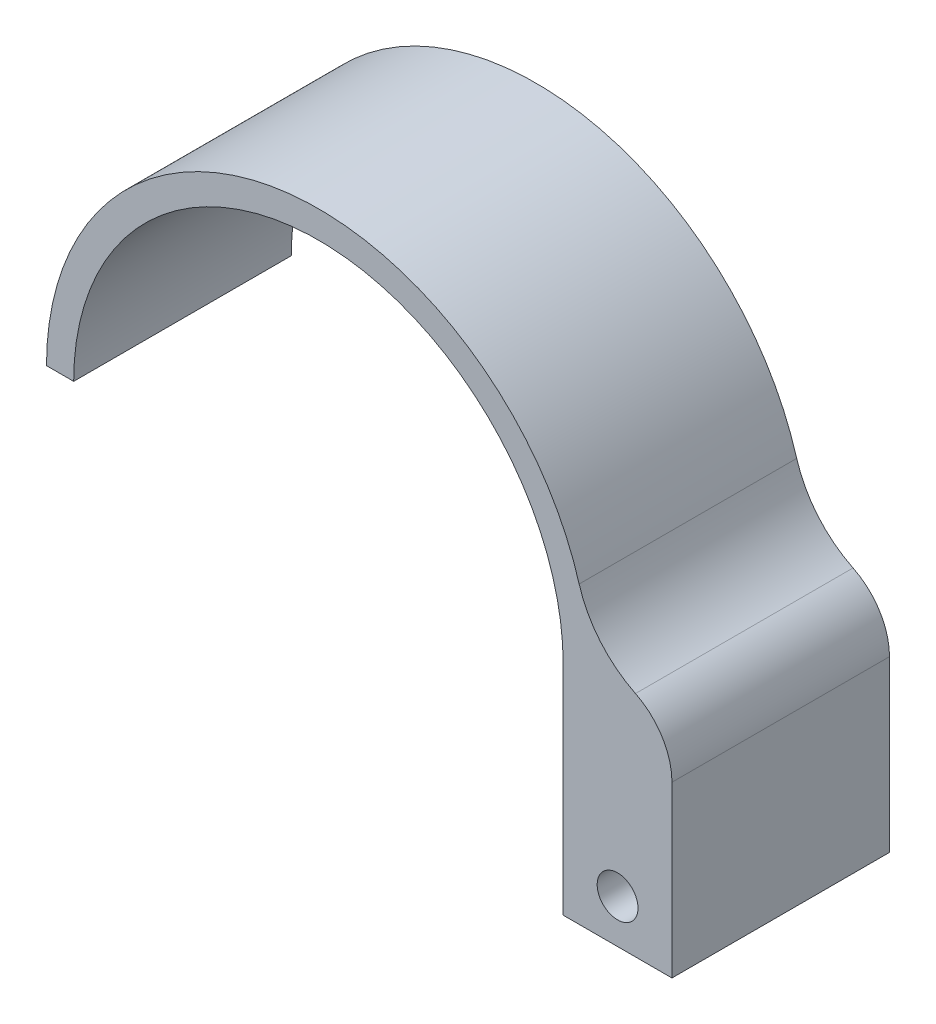
ISO-10303-21;
HEADER;
FILE_DESCRIPTION(('STEP AP214'),'2;1');
FILE_NAME('part.step','',(''),(''),'','','');
FILE_SCHEMA(('AUTOMOTIVE_DESIGN { 1 0 10303 214 1 1 1 1 }'));
ENDSEC;
DATA;
#1=APPLICATION_CONTEXT('core data for automotive mechanical design processes');
#2=APPLICATION_PROTOCOL_DEFINITION('international standard','automotive_design',2000,#1);
#3=PRODUCT_CONTEXT('',#1,'mechanical');
#4=PRODUCT('Part','Part','',(#3));
#5=PRODUCT_RELATED_PRODUCT_CATEGORY('part','',(#4));
#6=PRODUCT_DEFINITION_FORMATION('','',#4);
#7=PRODUCT_DEFINITION_CONTEXT('part definition',#1,'design');
#8=PRODUCT_DEFINITION('design','',#6,#7);
#9=PRODUCT_DEFINITION_SHAPE('','',#8);
#10=(LENGTH_UNIT() NAMED_UNIT(*) SI_UNIT(.MILLI.,.METRE.));
#11=(NAMED_UNIT(*) PLANE_ANGLE_UNIT() SI_UNIT($,.RADIAN.));
#12=(NAMED_UNIT(*) SI_UNIT($,.STERADIAN.) SOLID_ANGLE_UNIT());
#13=UNCERTAINTY_MEASURE_WITH_UNIT(LENGTH_MEASURE(1.E-05),#10,'distance_accuracy_value','');
#14=(GEOMETRIC_REPRESENTATION_CONTEXT(3) GLOBAL_UNCERTAINTY_ASSIGNED_CONTEXT((#13)) GLOBAL_UNIT_ASSIGNED_CONTEXT((#10,
#11,#12)) REPRESENTATION_CONTEXT('',''));
#15=CARTESIAN_POINT('',(0.,0.,0.));
#16=DIRECTION('',(0.,0.,1.));
#17=DIRECTION('',(1.,0.,0.));
#18=AXIS2_PLACEMENT_3D('',#15,#16,#17);
#19=CARTESIAN_POINT('',(0.,-3.80999999999999,9.525));
#20=DIRECTION('',(0.,0.,1.));
#21=DIRECTION('',(1.,0.,0.));
#22=AXIS2_PLACEMENT_3D('',#19,#20,#21);
#23=PLANE('',#22);
#24=CARTESIAN_POINT('',(34.925,-20.32,9.525));
#25=DIRECTION('',(0.,0.,1.));
#26=DIRECTION('',(1.,0.,0.));
#27=AXIS2_PLACEMENT_3D('',#24,#25,#26);
#28=CIRCLE('',#27,2.38125);
#29=CARTESIAN_POINT('',(37.30625,-20.32,9.525));
#30=VERTEX_POINT('',#29);
#31=EDGE_CURVE('E268',#30,#30,#28,.T.);
#32=ORIENTED_EDGE('',*,*,#31,.F.);
#33=EDGE_LOOP('',(#32));
#34=FACE_BOUND('',#33,.T.);
#35=DIRECTION('',(0.,-1.,0.));
#36=VECTOR('',#35,1.);
#37=CARTESIAN_POINT('',(31.3752420857191,-3.80999999999999,9.525));
#38=LINE('',#37,#36);
#39=CARTESIAN_POINT('',(31.3752420857191,-3.80999999999999,9.525));
#40=VERTEX_POINT('',#39);
#41=CARTESIAN_POINT('',(31.3752420857191,-22.86,9.525));
#42=VERTEX_POINT('',#41);
#43=EDGE_CURVE('E145',#40,#42,#38,.T.);
#44=ORIENTED_EDGE('',*,*,#43,.T.);
#45=DIRECTION('',(1.,0.,0.));
#46=VECTOR('',#45,1.);
#47=CARTESIAN_POINT('',(0.,-22.86,9.525));
#48=LINE('',#47,#46);
#49=CARTESIAN_POINT('',(38.4747579142809,-22.86,9.525));
#50=VERTEX_POINT('',#49);
#51=EDGE_CURVE('E129',#42,#50,#48,.T.);
#52=ORIENTED_EDGE('',*,*,#51,.T.);
#53=DIRECTION('',(0.,-1.,0.));
#54=VECTOR('',#53,1.);
#55=CARTESIAN_POINT('',(38.4747579142809,-3.80999999999999,9.525));
#56=LINE('',#55,#54);
#57=CARTESIAN_POINT('',(38.4747579142809,-3.80999999999999,9.525));
#58=VERTEX_POINT('',#57);
#59=EDGE_CURVE('E143',#58,#50,#56,.T.);
#60=ORIENTED_EDGE('',*,*,#59,.F.);
#61=DIRECTION('',(-1.,0.,0.));
#62=VECTOR('',#61,1.);
#63=CARTESIAN_POINT('',(0.,-3.80999999999999,9.525));
#64=LINE('',#63,#62);
#65=EDGE_CURVE('E253',#58,#40,#64,.T.);
#66=ORIENTED_EDGE('',*,*,#65,.T.);
#67=EDGE_LOOP('',(#44,#52,#60,#66));
#68=FACE_BOUND('',#67,.T.);
#69=ADVANCED_FACE('F39',(#34,#68),#23,.T.);
#70=CARTESIAN_POINT('',(0.,-3.80999999999999,15.875));
#71=DIRECTION('',(0.,0.,1.));
#72=DIRECTION('',(1.,0.,0.));
#73=AXIS2_PLACEMENT_3D('',#70,#71,#72);
#74=PLANE('',#73);
#75=CARTESIAN_POINT('',(34.925,-20.32,15.875));
#76=DIRECTION('',(0.,0.,1.));
#77=DIRECTION('',(1.,0.,0.));
#78=AXIS2_PLACEMENT_3D('',#75,#76,#77);
#79=CIRCLE('',#78,2.38125);
#80=CARTESIAN_POINT('',(37.30625,-20.32,15.875));
#81=VERTEX_POINT('',#80);
#82=EDGE_CURVE('E271',#81,#81,#79,.T.);
#83=ORIENTED_EDGE('',*,*,#82,.T.);
#84=EDGE_LOOP('',(#83));
#85=FACE_BOUND('',#84,.T.);
#86=DIRECTION('',(1.,0.,0.));
#87=VECTOR('',#86,1.);
#88=CARTESIAN_POINT('',(0.,-22.86,15.875));
#89=LINE('',#88,#87);
#90=CARTESIAN_POINT('',(31.3752420857191,-22.86,15.875));
#91=VERTEX_POINT('',#90);
#92=CARTESIAN_POINT('',(38.4747579142809,-22.86,15.875));
#93=VERTEX_POINT('',#92);
#94=EDGE_CURVE('E124',#91,#93,#89,.T.);
#95=ORIENTED_EDGE('',*,*,#94,.F.);
#96=DIRECTION('',(0.,-1.,0.));
#97=VECTOR('',#96,1.);
#98=CARTESIAN_POINT('',(31.3752420857191,-3.80999999999999,15.875));
#99=LINE('',#98,#97);
#100=CARTESIAN_POINT('',(31.3752420857191,-3.80999999999999,15.875));
#101=VERTEX_POINT('',#100);
#102=EDGE_CURVE('E137',#101,#91,#99,.T.);
#103=ORIENTED_EDGE('',*,*,#102,.F.);
#104=DIRECTION('',(-1.,0.,0.));
#105=VECTOR('',#104,1.);
#106=CARTESIAN_POINT('',(0.,-3.80999999999999,15.875));
#107=LINE('',#106,#105);
#108=CARTESIAN_POINT('',(38.4747579142809,-3.80999999999999,15.875));
#109=VERTEX_POINT('',#108);
#110=EDGE_CURVE('E141',#109,#101,#107,.T.);
#111=ORIENTED_EDGE('',*,*,#110,.F.);
#112=DIRECTION('',(0.,-1.,0.));
#113=VECTOR('',#112,1.);
#114=CARTESIAN_POINT('',(38.4747579142809,-3.80999999999999,15.875));
#115=LINE('',#114,#113);
#116=EDGE_CURVE('E134',#109,#93,#115,.T.);
#117=ORIENTED_EDGE('',*,*,#116,.T.);
#118=EDGE_LOOP('',(#95,#103,#111,#117));
#119=FACE_BOUND('',#118,.T.);
#120=ADVANCED_FACE('F139',(#85,#119),#74,.F.);
#121=CARTESIAN_POINT('',(0.,-25.4,25.4));
#122=DIRECTION('',(0.,1.,0.));
#123=DIRECTION('',(0.,0.,1.));
#124=AXIS2_PLACEMENT_3D('',#121,#122,#123);
#125=PLANE('',#124);
#126=DIRECTION('',(1.,0.,0.));
#127=VECTOR('',#126,1.);
#128=CARTESIAN_POINT('',(0.,-25.4,0.));
#129=LINE('',#128,#127);
#130=CARTESIAN_POINT('',(28.575,-25.4,0.));
#131=VERTEX_POINT('',#130);
#132=CARTESIAN_POINT('',(41.275,-25.4,0.));
#133=VERTEX_POINT('',#132);
#134=EDGE_CURVE('E173',#131,#133,#129,.T.);
#135=ORIENTED_EDGE('',*,*,#134,.T.);
#136=DIRECTION('',(0.,0.,-1.));
#137=VECTOR('',#136,1.);
#138=CARTESIAN_POINT('',(41.275,-25.4,25.4));
#139=LINE('',#138,#137);
#140=CARTESIAN_POINT('',(41.275,-25.4,25.4));
#141=VERTEX_POINT('',#140);
#142=EDGE_CURVE('E186',#141,#133,#139,.T.);
#143=ORIENTED_EDGE('',*,*,#142,.F.);
#144=DIRECTION('',(1.,0.,0.));
#145=VECTOR('',#144,1.);
#146=CARTESIAN_POINT('',(0.,-25.4,25.4));
#147=LINE('',#146,#145);
#148=CARTESIAN_POINT('',(28.575,-25.4,25.4));
#149=VERTEX_POINT('',#148);
#150=EDGE_CURVE('E158',#149,#141,#147,.T.);
#151=ORIENTED_EDGE('',*,*,#150,.F.);
#152=DIRECTION('',(0.,0.,-1.));
#153=VECTOR('',#152,1.);
#154=CARTESIAN_POINT('',(28.575,-25.4,25.4));
#155=LINE('',#154,#153);
#156=EDGE_CURVE('E189',#149,#131,#155,.T.);
#157=ORIENTED_EDGE('',*,*,#156,.T.);
#158=EDGE_LOOP('',(#135,#143,#151,#157));
#159=FACE_BOUND('',#158,.T.);
#160=CARTESIAN_POINT('',(34.925,-25.4,12.7));
#161=DIRECTION('',(0.,-1.,0.));
#162=DIRECTION('',(0.,0.,-1.));
#163=AXIS2_PLACEMENT_3D('',#160,#161,#162);
#164=CIRCLE('',#163,4.7625);
#165=CARTESIAN_POINT('',(34.925,-25.4,7.9375));
#166=VERTEX_POINT('',#165);
#167=EDGE_CURVE('E251',#166,#166,#164,.T.);
#168=ORIENTED_EDGE('',*,*,#167,.F.);
#169=EDGE_LOOP('',(#168));
#170=FACE_BOUND('',#169,.T.);
#171=ADVANCED_FACE('F245',(#159,#170),#125,.F.);
#172=CARTESIAN_POINT('',(0.,0.,25.4));
#173=DIRECTION('',(0.,0.,-1.));
#174=DIRECTION('',(-1.,0.,0.));
#175=AXIS2_PLACEMENT_3D('',#172,#173,#174);
#176=CYLINDRICAL_SURFACE('',#175,28.575);
#177=CARTESIAN_POINT('',(0.,0.,0.));
#178=DIRECTION('',(0.,0.,1.));
#179=DIRECTION('',(1.,0.,0.));
#180=AXIS2_PLACEMENT_3D('',#177,#178,#179);
#181=CIRCLE('',#180,28.575);
#182=CARTESIAN_POINT('',(28.575,0.,0.));
#183=VERTEX_POINT('',#182);
#184=CARTESIAN_POINT('',(-28.575,0.,0.));
#185=VERTEX_POINT('',#184);
#186=EDGE_CURVE('E168',#183,#185,#181,.T.);
#187=ORIENTED_EDGE('',*,*,#186,.F.);
#188=DIRECTION('',(0.,0.,-1.));
#189=VECTOR('',#188,1.);
#190=CARTESIAN_POINT('',(28.575,0.,25.4));
#191=LINE('',#190,#189);
#192=CARTESIAN_POINT('',(28.575,0.,25.4));
#193=VERTEX_POINT('',#192);
#194=EDGE_CURVE('E192',#193,#183,#191,.T.);
#195=ORIENTED_EDGE('',*,*,#194,.F.);
#196=CARTESIAN_POINT('',(0.,0.,25.4));
#197=DIRECTION('',(0.,0.,1.));
#198=DIRECTION('',(1.,0.,0.));
#199=AXIS2_PLACEMENT_3D('',#196,#197,#198);
#200=CIRCLE('',#199,28.575);
#201=CARTESIAN_POINT('',(-28.575,0.,25.4));
#202=VERTEX_POINT('',#201);
#203=EDGE_CURVE('E152',#193,#202,#200,.T.);
#204=ORIENTED_EDGE('',*,*,#203,.T.);
#205=DIRECTION('',(0.,0.,-1.));
#206=VECTOR('',#205,1.);
#207=CARTESIAN_POINT('',(-28.575,0.,25.4));
#208=LINE('',#207,#206);
#209=EDGE_CURVE('E167',#202,#185,#208,.T.);
#210=ORIENTED_EDGE('',*,*,#209,.T.);
#211=EDGE_LOOP('',(#187,#195,#204,#210));
#212=FACE_BOUND('',#211,.T.);
#213=ADVANCED_FACE('F239',(#212),#176,.F.);
#214=CARTESIAN_POINT('',(28.575,0.,25.4));
#215=DIRECTION('',(1.,0.,0.));
#216=DIRECTION('',(0.,0.,-1.));
#217=AXIS2_PLACEMENT_3D('',#214,#215,#216);
#218=PLANE('',#217);
#219=DIRECTION('',(0.,-1.,0.));
#220=VECTOR('',#219,1.);
#221=CARTESIAN_POINT('',(28.575,0.,0.));
#222=LINE('',#221,#220);
#223=EDGE_CURVE('E171',#183,#131,#222,.T.);
#224=ORIENTED_EDGE('',*,*,#223,.T.);
#225=ORIENTED_EDGE('',*,*,#156,.F.);
#226=DIRECTION('',(0.,-1.,0.));
#227=VECTOR('',#226,1.);
#228=CARTESIAN_POINT('',(28.575,0.,25.4));
#229=LINE('',#228,#227);
#230=EDGE_CURVE('E155',#193,#149,#229,.T.);
#231=ORIENTED_EDGE('',*,*,#230,.F.);
#232=ORIENTED_EDGE('',*,*,#194,.T.);
#233=EDGE_LOOP('',(#224,#225,#231,#232));
#234=FACE_BOUND('',#233,.T.);
#235=ADVANCED_FACE('F242',(#234),#218,.F.);
#236=CARTESIAN_POINT('',(41.275,0.,25.4));
#237=DIRECTION('',(1.,0.,0.));
#238=DIRECTION('',(0.,1.,0.));
#239=AXIS2_PLACEMENT_3D('',#236,#237,#238);
#240=PLANE('',#239);
#241=DIRECTION('',(0.,-1.,0.));
#242=VECTOR('',#241,1.);
#243=CARTESIAN_POINT('',(41.275,0.,0.));
#244=LINE('',#243,#242);
#245=CARTESIAN_POINT('',(41.275,-5.60752620264798,0.));
#246=VERTEX_POINT('',#245);
#247=EDGE_CURVE('E176',#246,#133,#244,.T.);
#248=ORIENTED_EDGE('',*,*,#247,.F.);
#249=DIRECTION('',(0.,0.,-1.));
#250=VECTOR('',#249,1.);
#251=CARTESIAN_POINT('',(41.275,-5.60752620264798,25.4));
#252=LINE('',#251,#250);
#253=CARTESIAN_POINT('',(41.275,-5.60752620264798,25.4));
#254=VERTEX_POINT('',#253);
#255=EDGE_CURVE('E47',#246,#254,#252,.F.);
#256=ORIENTED_EDGE('',*,*,#255,.T.);
#257=DIRECTION('',(0.,-1.,0.));
#258=VECTOR('',#257,1.);
#259=CARTESIAN_POINT('',(41.275,0.,25.4));
#260=LINE('',#259,#258);
#261=EDGE_CURVE('E161',#254,#141,#260,.T.);
#262=ORIENTED_EDGE('',*,*,#261,.T.);
#263=ORIENTED_EDGE('',*,*,#142,.T.);
#264=EDGE_LOOP('',(#248,#256,#262,#263));
#265=FACE_BOUND('',#264,.T.);
#266=ADVANCED_FACE('F210',(#265),#240,.T.);
#267=CARTESIAN_POINT('',(0.,0.,25.4));
#268=DIRECTION('',(0.,0.,-1.));
#269=DIRECTION('',(-1.,0.,0.));
#270=AXIS2_PLACEMENT_3D('',#267,#268,#269);
#271=CYLINDRICAL_SURFACE('',#270,31.75);
#272=CARTESIAN_POINT('',(0.,0.,25.4));
#273=DIRECTION('',(0.,0.,1.));
#274=DIRECTION('',(1.,0.,0.));
#275=AXIS2_PLACEMENT_3D('',#272,#273,#274);
#276=CIRCLE('',#275,31.75);
#277=CARTESIAN_POINT('',(30.4416208791209,9.02054423257666,25.4));
#278=VERTEX_POINT('',#277);
#279=CARTESIAN_POINT('',(-31.75,0.,25.4));
#280=VERTEX_POINT('',#279);
#281=EDGE_CURVE('E163',#278,#280,#276,.T.);
#282=ORIENTED_EDGE('',*,*,#281,.F.);
#283=DIRECTION('',(0.,0.,-1.));
#284=VECTOR('',#283,1.);
#285=CARTESIAN_POINT('',(30.4416208791209,9.02054423257666,25.4));
#286=LINE('',#285,#284);
#287=CARTESIAN_POINT('',(30.4416208791209,9.02054423257666,0.));
#288=VERTEX_POINT('',#287);
#289=EDGE_CURVE('E194',#278,#288,#286,.T.);
#290=ORIENTED_EDGE('',*,*,#289,.T.);
#291=CARTESIAN_POINT('',(0.,0.,0.));
#292=DIRECTION('',(0.,0.,1.));
#293=DIRECTION('',(1.,0.,0.));
#294=AXIS2_PLACEMENT_3D('',#291,#292,#293);
#295=CIRCLE('',#294,31.75);
#296=CARTESIAN_POINT('',(-31.75,0.,0.));
#297=VERTEX_POINT('',#296);
#298=EDGE_CURVE('E178',#288,#297,#295,.T.);
#299=ORIENTED_EDGE('',*,*,#298,.T.);
#300=DIRECTION('',(0.,0.,-1.));
#301=VECTOR('',#300,1.);
#302=CARTESIAN_POINT('',(-31.75,0.,25.4));
#303=LINE('',#302,#301);
#304=EDGE_CURVE('E183',#280,#297,#303,.T.);
#305=ORIENTED_EDGE('',*,*,#304,.F.);
#306=EDGE_LOOP('',(#282,#290,#299,#305));
#307=FACE_BOUND('',#306,.T.);
#308=ADVANCED_FACE('F229',(#307),#271,.T.);
#309=CARTESIAN_POINT('',(0.,0.,25.4));
#310=DIRECTION('',(0.,1.,0.));
#311=DIRECTION('',(0.,0.,1.));
#312=AXIS2_PLACEMENT_3D('',#309,#310,#311);
#313=PLANE('',#312);
#314=DIRECTION('',(1.,0.,0.));
#315=VECTOR('',#314,1.);
#316=CARTESIAN_POINT('',(0.,0.,0.));
#317=LINE('',#316,#315);
#318=EDGE_CURVE('E156',#297,#185,#317,.T.);
#319=ORIENTED_EDGE('',*,*,#318,.T.);
#320=ORIENTED_EDGE('',*,*,#209,.F.);
#321=DIRECTION('',(1.,0.,0.));
#322=VECTOR('',#321,1.);
#323=CARTESIAN_POINT('',(0.,0.,25.4));
#324=LINE('',#323,#322);
#325=EDGE_CURVE('E165',#280,#202,#324,.T.);
#326=ORIENTED_EDGE('',*,*,#325,.F.);
#327=ORIENTED_EDGE('',*,*,#304,.T.);
#328=EDGE_LOOP('',(#319,#320,#326,#327));
#329=FACE_BOUND('',#328,.T.);
#330=ADVANCED_FACE('F232',(#329),#313,.F.);
#331=CARTESIAN_POINT('',(0.,0.,25.4));
#332=DIRECTION('',(0.,0.,1.));
#333=DIRECTION('',(1.,0.,0.));
#334=AXIS2_PLACEMENT_3D('',#331,#332,#333);
#335=PLANE('',#334);
#336=CARTESIAN_POINT('',(34.925,-20.32,25.4));
#337=DIRECTION('',(0.,0.,1.));
#338=DIRECTION('',(1.,0.,0.));
#339=AXIS2_PLACEMENT_3D('',#336,#337,#338);
#340=CIRCLE('',#339,2.38125);
#341=CARTESIAN_POINT('',(37.30625,-20.32,25.4));
#342=VERTEX_POINT('',#341);
#343=EDGE_CURVE('E275',#342,#342,#340,.T.);
#344=ORIENTED_EDGE('',*,*,#343,.F.);
#345=EDGE_LOOP('',(#344));
#346=FACE_BOUND('',#345,.T.);
#347=ORIENTED_EDGE('',*,*,#261,.F.);
#348=CARTESIAN_POINT('',(33.655,-5.60752620264798,25.4));
#349=DIRECTION('',(0.,0.,1.));
#350=DIRECTION('',(1.,0.,0.));
#351=AXIS2_PLACEMENT_3D('',#348,#349,#350);
#352=CIRCLE('',#351,7.62);
#353=CARTESIAN_POINT('',(37.0162259615385,1.23108184544776,25.4));
#354=VERTEX_POINT('',#353);
#355=EDGE_CURVE('E11',#254,#354,#352,.T.);
#356=ORIENTED_EDGE('',*,*,#355,.T.);
#357=CARTESIAN_POINT('',(42.6182692307692,12.6287619256073,25.4));
#358=DIRECTION('',(0.,0.,1.));
#359=DIRECTION('',(1.,0.,0.));
#360=AXIS2_PLACEMENT_3D('',#357,#358,#359);
#361=CIRCLE('',#360,12.7);
#362=EDGE_CURVE('E200',#354,#278,#361,.F.);
#363=ORIENTED_EDGE('',*,*,#362,.T.);
#364=ORIENTED_EDGE('',*,*,#281,.T.);
#365=ORIENTED_EDGE('',*,*,#325,.T.);
#366=ORIENTED_EDGE('',*,*,#203,.F.);
#367=ORIENTED_EDGE('',*,*,#230,.T.);
#368=ORIENTED_EDGE('',*,*,#150,.T.);
#369=EDGE_LOOP('',(#347,#356,#363,#364,#365,#366,#367,#368));
#370=FACE_BOUND('',#369,.T.);
#371=ADVANCED_FACE('F214',(#346,#370),#335,.T.);
#372=CARTESIAN_POINT('',(0.,0.,0.));
#373=DIRECTION('',(0.,0.,1.));
#374=DIRECTION('',(1.,0.,0.));
#375=AXIS2_PLACEMENT_3D('',#372,#373,#374);
#376=PLANE('',#375);
#377=CARTESIAN_POINT('',(34.925,-20.32,0.));
#378=DIRECTION('',(0.,0.,1.));
#379=DIRECTION('',(1.,0.,0.));
#380=AXIS2_PLACEMENT_3D('',#377,#378,#379);
#381=CIRCLE('',#380,2.38125);
#382=CARTESIAN_POINT('',(37.30625,-20.32,0.));
#383=VERTEX_POINT('',#382);
#384=EDGE_CURVE('E274',#383,#383,#381,.T.);
#385=ORIENTED_EDGE('',*,*,#384,.T.);
#386=EDGE_LOOP('',(#385));
#387=FACE_BOUND('',#386,.T.);
#388=CARTESIAN_POINT('',(42.6182692307692,12.6287619256073,0.));
#389=DIRECTION('',(0.,0.,1.));
#390=DIRECTION('',(1.,0.,0.));
#391=AXIS2_PLACEMENT_3D('',#388,#389,#390);
#392=CIRCLE('',#391,12.7);
#393=CARTESIAN_POINT('',(37.0162259615385,1.23108184544776,0.));
#394=VERTEX_POINT('',#393);
#395=EDGE_CURVE('E197',#288,#394,#392,.T.);
#396=ORIENTED_EDGE('',*,*,#395,.T.);
#397=CARTESIAN_POINT('',(33.655,-5.60752620264798,0.));
#398=DIRECTION('',(0.,0.,1.));
#399=DIRECTION('',(1.,0.,0.));
#400=AXIS2_PLACEMENT_3D('',#397,#398,#399);
#401=CIRCLE('',#400,7.62);
#402=EDGE_CURVE('E205',#394,#246,#401,.F.);
#403=ORIENTED_EDGE('',*,*,#402,.T.);
#404=ORIENTED_EDGE('',*,*,#247,.T.);
#405=ORIENTED_EDGE('',*,*,#134,.F.);
#406=ORIENTED_EDGE('',*,*,#223,.F.);
#407=ORIENTED_EDGE('',*,*,#186,.T.);
#408=ORIENTED_EDGE('',*,*,#318,.F.);
#409=ORIENTED_EDGE('',*,*,#298,.F.);
#410=EDGE_LOOP('',(#396,#403,#404,#405,#406,#407,#408,#409));
#411=FACE_BOUND('',#410,.T.);
#412=ADVANCED_FACE('F224',(#387,#411),#376,.F.);
#413=CARTESIAN_POINT('',(42.6182692307692,12.6287619256073,25.4));
#414=DIRECTION('',(0.,0.,1.));
#415=DIRECTION('',(1.,0.,0.));
#416=AXIS2_PLACEMENT_3D('',#413,#414,#415);
#417=CYLINDRICAL_SURFACE('',#416,12.7);
#418=ORIENTED_EDGE('',*,*,#362,.F.);
#419=DIRECTION('',(0.,0.,1.));
#420=VECTOR('',#419,1.);
#421=CARTESIAN_POINT('',(37.0162259615385,1.23108184544776,25.4));
#422=LINE('',#421,#420);
#423=EDGE_CURVE('E202',#354,#394,#422,.F.);
#424=ORIENTED_EDGE('',*,*,#423,.T.);
#425=ORIENTED_EDGE('',*,*,#395,.F.);
#426=ORIENTED_EDGE('',*,*,#289,.F.);
#427=EDGE_LOOP('',(#418,#424,#425,#426));
#428=FACE_BOUND('',#427,.T.);
#429=ADVANCED_FACE('F220',(#428),#417,.F.);
#430=CARTESIAN_POINT('',(33.655,-5.60752620264798,25.4));
#431=DIRECTION('',(0.,0.,1.));
#432=DIRECTION('',(1.,0.,0.));
#433=AXIS2_PLACEMENT_3D('',#430,#431,#432);
#434=CYLINDRICAL_SURFACE('',#433,7.62);
#435=ORIENTED_EDGE('',*,*,#355,.F.);
#436=ORIENTED_EDGE('',*,*,#255,.F.);
#437=ORIENTED_EDGE('',*,*,#402,.F.);
#438=ORIENTED_EDGE('',*,*,#423,.F.);
#439=EDGE_LOOP('',(#435,#436,#437,#438));
#440=FACE_BOUND('',#439,.T.);
#441=ADVANCED_FACE('F41',(#440),#434,.T.);
#442=CARTESIAN_POINT('',(34.925,-3.80999999999999,12.7));
#443=DIRECTION('',(0.,-1.,0.));
#444=DIRECTION('',(0.,0.,-1.));
#445=AXIS2_PLACEMENT_3D('',#442,#443,#444);
#446=CYLINDRICAL_SURFACE('',#445,4.7625);
#447=ORIENTED_EDGE('',*,*,#167,.T.);
#448=EDGE_LOOP('',(#447));
#449=FACE_BOUND('',#448,.T.);
#450=CARTESIAN_POINT('',(34.925,-22.86,12.7));
#451=DIRECTION('',(0.,-1.,0.));
#452=DIRECTION('',(0.,0.,-1.));
#453=AXIS2_PLACEMENT_3D('',#450,#451,#452);
#454=CIRCLE('',#453,4.7625);
#455=EDGE_CURVE('E60',#42,#50,#454,.T.);
#456=ORIENTED_EDGE('',*,*,#455,.F.);
#457=ORIENTED_EDGE('',*,*,#43,.F.);
#458=CARTESIAN_POINT('',(34.925,-3.80999999999999,12.7));
#459=DIRECTION('',(0.,-1.,0.));
#460=DIRECTION('',(0.,0.,-1.));
#461=AXIS2_PLACEMENT_3D('',#458,#459,#460);
#462=CIRCLE('',#461,4.7625);
#463=EDGE_CURVE('E148',#101,#40,#462,.T.);
#464=ORIENTED_EDGE('',*,*,#463,.F.);
#465=ORIENTED_EDGE('',*,*,#102,.T.);
#466=EDGE_CURVE('E53',#93,#91,#454,.T.);
#467=ORIENTED_EDGE('',*,*,#466,.F.);
#468=ORIENTED_EDGE('',*,*,#116,.F.);
#469=EDGE_CURVE('E255',#58,#109,#462,.T.);
#470=ORIENTED_EDGE('',*,*,#469,.F.);
#471=ORIENTED_EDGE('',*,*,#59,.T.);
#472=EDGE_LOOP('',(#456,#457,#464,#465,#467,#468,#470,#471));
#473=FACE_BOUND('',#472,.T.);
#474=ADVANCED_FACE('F132',(#449,#473),#446,.F.);
#475=CARTESIAN_POINT('',(0.,-3.80999999999999,0.));
#476=DIRECTION('',(0.,-1.,0.));
#477=DIRECTION('',(0.,0.,-1.));
#478=AXIS2_PLACEMENT_3D('',#475,#476,#477);
#479=PLANE('',#478);
#480=ORIENTED_EDGE('',*,*,#65,.F.);
#481=ORIENTED_EDGE('',*,*,#469,.T.);
#482=ORIENTED_EDGE('',*,*,#110,.T.);
#483=ORIENTED_EDGE('',*,*,#463,.T.);
#484=EDGE_LOOP('',(#480,#481,#482,#483));
#485=FACE_BOUND('',#484,.T.);
#486=ADVANCED_FACE('F266',(#485),#479,.T.);
#487=CARTESIAN_POINT('',(34.925,-22.86,12.7));
#488=DIRECTION('',(0.,-1.,0.));
#489=DIRECTION('',(0.,0.,-1.));
#490=AXIS2_PLACEMENT_3D('',#487,#488,#489);
#491=PLANE('',#490);
#492=ORIENTED_EDGE('',*,*,#94,.T.);
#493=ORIENTED_EDGE('',*,*,#466,.T.);
#494=EDGE_LOOP('',(#492,#493));
#495=FACE_BOUND('',#494,.T.);
#496=ADVANCED_FACE('F125',(#495),#491,.T.);
#497=ORIENTED_EDGE('',*,*,#455,.T.);
#498=ORIENTED_EDGE('',*,*,#51,.F.);
#499=EDGE_LOOP('',(#497,#498));
#500=FACE_BOUND('',#499,.T.);
#501=ADVANCED_FACE('F285',(#500),#491,.T.);
#502=CARTESIAN_POINT('',(34.925,-20.32,0.));
#503=DIRECTION('',(0.,0.,1.));
#504=DIRECTION('',(1.,0.,0.));
#505=AXIS2_PLACEMENT_3D('',#502,#503,#504);
#506=CYLINDRICAL_SURFACE('',#505,2.38125);
#507=ORIENTED_EDGE('',*,*,#31,.T.);
#508=EDGE_LOOP('',(#507));
#509=FACE_BOUND('',#508,.T.);
#510=ORIENTED_EDGE('',*,*,#384,.F.);
#511=EDGE_LOOP('',(#510));
#512=FACE_BOUND('',#511,.T.);
#513=ADVANCED_FACE('F282',(#509,#512),#506,.F.);
#514=ORIENTED_EDGE('',*,*,#343,.T.);
#515=EDGE_LOOP('',(#514));
#516=FACE_BOUND('',#515,.T.);
#517=ORIENTED_EDGE('',*,*,#82,.F.);
#518=EDGE_LOOP('',(#517));
#519=FACE_BOUND('',#518,.T.);
#520=ADVANCED_FACE('F284',(#516,#519),#506,.F.);
#521=CLOSED_SHELL('',(#69,#120,#171,#213,#235,#266,#308,#330,#371,#412,#429,#441,#474,#486,#496,
#501,#513,#520));
#522=MANIFOLD_SOLID_BREP('B2',#521);
#523=ADVANCED_BREP_SHAPE_REPRESENTATION('',(#18,#522),#14);
#524=SHAPE_DEFINITION_REPRESENTATION(#9,#523);
ENDSEC;
END-ISO-10303-21;
